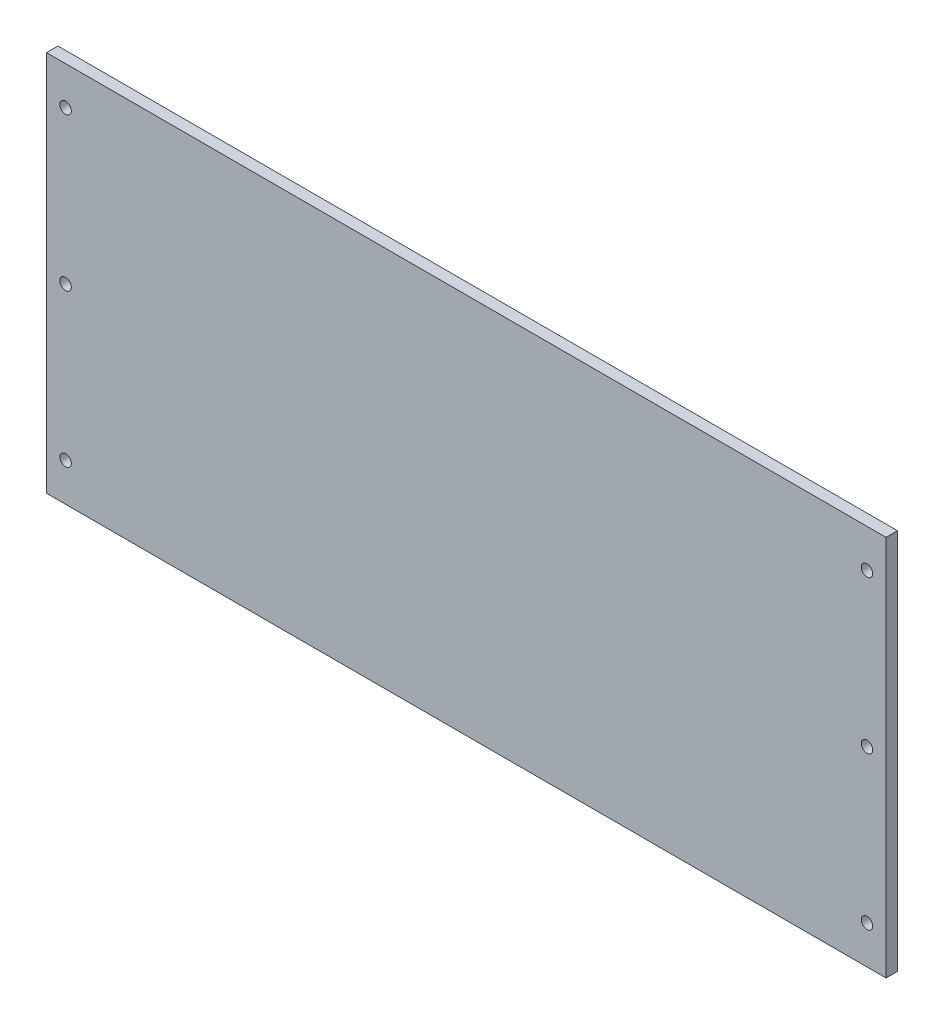
ISO-10303-21;
HEADER;
FILE_DESCRIPTION(('STEP AP214'),'2;1');
FILE_NAME('part.step','',(''),(''),'','','');
FILE_SCHEMA(('AUTOMOTIVE_DESIGN { 1 0 10303 214 1 1 1 1 }'));
ENDSEC;
DATA;
#1=APPLICATION_CONTEXT('core data for automotive mechanical design processes');
#2=APPLICATION_PROTOCOL_DEFINITION('international standard','automotive_design',2000,#1);
#3=PRODUCT_CONTEXT('',#1,'mechanical');
#4=PRODUCT('Part','Part','',(#3));
#5=PRODUCT_RELATED_PRODUCT_CATEGORY('part','',(#4));
#6=PRODUCT_DEFINITION_FORMATION('','',#4);
#7=PRODUCT_DEFINITION_CONTEXT('part definition',#1,'design');
#8=PRODUCT_DEFINITION('design','',#6,#7);
#9=PRODUCT_DEFINITION_SHAPE('','',#8);
#10=(LENGTH_UNIT() NAMED_UNIT(*) SI_UNIT(.MILLI.,.METRE.));
#11=(NAMED_UNIT(*) PLANE_ANGLE_UNIT() SI_UNIT($,.RADIAN.));
#12=(NAMED_UNIT(*) SI_UNIT($,.STERADIAN.) SOLID_ANGLE_UNIT());
#13=UNCERTAINTY_MEASURE_WITH_UNIT(LENGTH_MEASURE(1.E-05),#10,'distance_accuracy_value','');
#14=(GEOMETRIC_REPRESENTATION_CONTEXT(3) GLOBAL_UNCERTAINTY_ASSIGNED_CONTEXT((#13)) GLOBAL_UNIT_ASSIGNED_CONTEXT((#10,
#11,#12)) REPRESENTATION_CONTEXT('',''));
#15=CARTESIAN_POINT('',(0.,0.,0.));
#16=DIRECTION('',(0.,0.,1.));
#17=DIRECTION('',(1.,0.,0.));
#18=AXIS2_PLACEMENT_3D('',#15,#16,#17);
#19=CARTESIAN_POINT('',(0.,0.,3.));
#20=DIRECTION('',(0.,0.,1.));
#21=DIRECTION('',(1.,0.,0.));
#22=AXIS2_PLACEMENT_3D('',#19,#20,#21);
#23=PLANE('',#22);
#24=CARTESIAN_POINT('',(105.,-1.45716771982052E-13,3.));
#25=DIRECTION('',(0.,0.,1.));
#26=DIRECTION('',(-1.,0.,0.));
#27=AXIS2_PLACEMENT_3D('',#24,#25,#26);
#28=CIRCLE('',#27,1.50000000000002);
#29=CARTESIAN_POINT('',(103.5,-1.45716771982052E-13,3.));
#30=VERTEX_POINT('',#29);
#31=EDGE_CURVE('E133',#30,#30,#28,.T.);
#32=ORIENTED_EDGE('',*,*,#31,.F.);
#33=EDGE_LOOP('',(#32));
#34=FACE_BOUND('',#33,.T.);
#35=CARTESIAN_POINT('',(-105.,39.9999999999998,3.));
#36=DIRECTION('',(0.,0.,1.));
#37=DIRECTION('',(1.,0.,0.));
#38=AXIS2_PLACEMENT_3D('',#35,#36,#37);
#39=CIRCLE('',#38,1.5);
#40=CARTESIAN_POINT('',(-103.5,39.9999999999998,3.));
#41=VERTEX_POINT('',#40);
#42=EDGE_CURVE('E121',#41,#41,#39,.T.);
#43=ORIENTED_EDGE('',*,*,#42,.F.);
#44=EDGE_LOOP('',(#43));
#45=FACE_BOUND('',#44,.T.);
#46=CARTESIAN_POINT('',(-105.,-40.0000000000002,3.));
#47=DIRECTION('',(0.,0.,1.));
#48=DIRECTION('',(1.,0.,0.));
#49=AXIS2_PLACEMENT_3D('',#46,#47,#48);
#50=CIRCLE('',#49,1.5);
#51=CARTESIAN_POINT('',(-103.5,-40.0000000000002,3.));
#52=VERTEX_POINT('',#51);
#53=EDGE_CURVE('E100',#52,#52,#50,.T.);
#54=ORIENTED_EDGE('',*,*,#53,.F.);
#55=EDGE_LOOP('',(#54));
#56=FACE_BOUND('',#55,.T.);
#57=DIRECTION('',(0.,-1.,0.));
#58=VECTOR('',#57,1.);
#59=CARTESIAN_POINT('',(-110.,-50.0000000000002,3.));
#60=LINE('',#59,#58);
#61=CARTESIAN_POINT('',(-110.,49.9999999999998,3.));
#62=VERTEX_POINT('',#61);
#63=CARTESIAN_POINT('',(-110.,-50.0000000000002,3.));
#64=VERTEX_POINT('',#63);
#65=EDGE_CURVE('E85',#62,#64,#60,.T.);
#66=ORIENTED_EDGE('',*,*,#65,.T.);
#67=DIRECTION('',(1.,0.,0.));
#68=VECTOR('',#67,1.);
#69=CARTESIAN_POINT('',(110.,-50.0000000000001,3.));
#70=LINE('',#69,#68);
#71=CARTESIAN_POINT('',(110.,-50.0000000000001,3.));
#72=VERTEX_POINT('',#71);
#73=EDGE_CURVE('E80',#64,#72,#70,.T.);
#74=ORIENTED_EDGE('',*,*,#73,.T.);
#75=DIRECTION('',(0.,1.,0.));
#76=VECTOR('',#75,1.);
#77=CARTESIAN_POINT('',(110.,-50.0000000000001,3.));
#78=LINE('',#77,#76);
#79=CARTESIAN_POINT('',(110.,49.9999999999998,3.));
#80=VERTEX_POINT('',#79);
#81=EDGE_CURVE('E83',#72,#80,#78,.T.);
#82=ORIENTED_EDGE('',*,*,#81,.T.);
#83=DIRECTION('',(-1.,0.,0.));
#84=VECTOR('',#83,1.);
#85=CARTESIAN_POINT('',(110.,49.9999999999998,3.));
#86=LINE('',#85,#84);
#87=EDGE_CURVE('E50',#80,#62,#86,.T.);
#88=ORIENTED_EDGE('',*,*,#87,.T.);
#89=EDGE_LOOP('',(#66,#74,#82,#88));
#90=FACE_BOUND('',#89,.T.);
#91=CARTESIAN_POINT('',(-105.,-1.73472347597681E-13,3.));
#92=DIRECTION('',(0.,0.,1.));
#93=DIRECTION('',(1.,0.,0.));
#94=AXIS2_PLACEMENT_3D('',#91,#92,#93);
#95=CIRCLE('',#94,1.5);
#96=CARTESIAN_POINT('',(-103.5,-1.73472347597681E-13,3.));
#97=VERTEX_POINT('',#96);
#98=EDGE_CURVE('E115',#97,#97,#95,.T.);
#99=ORIENTED_EDGE('',*,*,#98,.F.);
#100=EDGE_LOOP('',(#99));
#101=FACE_BOUND('',#100,.T.);
#102=CARTESIAN_POINT('',(105.,39.9999999999999,3.));
#103=DIRECTION('',(0.,0.,1.));
#104=DIRECTION('',(-1.,0.,0.));
#105=AXIS2_PLACEMENT_3D('',#102,#103,#104);
#106=CIRCLE('',#105,1.5);
#107=CARTESIAN_POINT('',(103.5,39.9999999999999,3.));
#108=VERTEX_POINT('',#107);
#109=EDGE_CURVE('E127',#108,#108,#106,.T.);
#110=ORIENTED_EDGE('',*,*,#109,.F.);
#111=EDGE_LOOP('',(#110));
#112=FACE_BOUND('',#111,.T.);
#113=CARTESIAN_POINT('',(105.,-40.0000000000001,3.));
#114=DIRECTION('',(0.,0.,1.));
#115=DIRECTION('',(-1.,0.,0.));
#116=AXIS2_PLACEMENT_3D('',#113,#114,#115);
#117=CIRCLE('',#116,1.5);
#118=CARTESIAN_POINT('',(103.5,-40.0000000000001,3.));
#119=VERTEX_POINT('',#118);
#120=EDGE_CURVE('E139',#119,#119,#117,.T.);
#121=ORIENTED_EDGE('',*,*,#120,.F.);
#122=EDGE_LOOP('',(#121));
#123=FACE_BOUND('',#122,.T.);
#124=ADVANCED_FACE('F33',(#34,#45,#56,#90,#101,#112,#123),#23,.T.);
#125=CARTESIAN_POINT('',(0.,0.,0.));
#126=DIRECTION('',(0.,0.,1.));
#127=DIRECTION('',(1.,0.,0.));
#128=AXIS2_PLACEMENT_3D('',#125,#126,#127);
#129=PLANE('',#128);
#130=DIRECTION('',(0.,-1.,0.));
#131=VECTOR('',#130,1.);
#132=CARTESIAN_POINT('',(-110.,-50.0000000000002,0.));
#133=LINE('',#132,#131);
#134=CARTESIAN_POINT('',(-110.,49.9999999999998,0.));
#135=VERTEX_POINT('',#134);
#136=CARTESIAN_POINT('',(-110.,-50.0000000000002,0.));
#137=VERTEX_POINT('',#136);
#138=EDGE_CURVE('E97',#135,#137,#133,.T.);
#139=ORIENTED_EDGE('',*,*,#138,.F.);
#140=DIRECTION('',(-1.,0.,0.));
#141=VECTOR('',#140,1.);
#142=CARTESIAN_POINT('',(110.,49.9999999999998,0.));
#143=LINE('',#142,#141);
#144=CARTESIAN_POINT('',(110.,49.9999999999998,0.));
#145=VERTEX_POINT('',#144);
#146=EDGE_CURVE('E73',#145,#135,#143,.T.);
#147=ORIENTED_EDGE('',*,*,#146,.F.);
#148=DIRECTION('',(0.,1.,0.));
#149=VECTOR('',#148,1.);
#150=CARTESIAN_POINT('',(110.,-50.0000000000001,0.));
#151=LINE('',#150,#149);
#152=CARTESIAN_POINT('',(110.,-50.0000000000001,0.));
#153=VERTEX_POINT('',#152);
#154=EDGE_CURVE('E67',#153,#145,#151,.T.);
#155=ORIENTED_EDGE('',*,*,#154,.F.);
#156=DIRECTION('',(1.,0.,0.));
#157=VECTOR('',#156,1.);
#158=CARTESIAN_POINT('',(110.,-50.0000000000001,0.));
#159=LINE('',#158,#157);
#160=EDGE_CURVE('E89',#137,#153,#159,.T.);
#161=ORIENTED_EDGE('',*,*,#160,.F.);
#162=EDGE_LOOP('',(#139,#147,#155,#161));
#163=FACE_BOUND('',#162,.T.);
#164=CARTESIAN_POINT('',(-105.,-40.0000000000002,0.));
#165=DIRECTION('',(0.,0.,1.));
#166=DIRECTION('',(1.,0.,0.));
#167=AXIS2_PLACEMENT_3D('',#164,#165,#166);
#168=CIRCLE('',#167,1.5);
#169=CARTESIAN_POINT('',(-103.5,-40.0000000000002,0.));
#170=VERTEX_POINT('',#169);
#171=EDGE_CURVE('E112',#170,#170,#168,.T.);
#172=ORIENTED_EDGE('',*,*,#171,.T.);
#173=EDGE_LOOP('',(#172));
#174=FACE_BOUND('',#173,.T.);
#175=CARTESIAN_POINT('',(-105.,-1.73472347597681E-13,0.));
#176=DIRECTION('',(0.,0.,1.));
#177=DIRECTION('',(1.,0.,0.));
#178=AXIS2_PLACEMENT_3D('',#175,#176,#177);
#179=CIRCLE('',#178,1.5);
#180=CARTESIAN_POINT('',(-103.5,-1.73472347597681E-13,0.));
#181=VERTEX_POINT('',#180);
#182=EDGE_CURVE('E118',#181,#181,#179,.T.);
#183=ORIENTED_EDGE('',*,*,#182,.T.);
#184=EDGE_LOOP('',(#183));
#185=FACE_BOUND('',#184,.T.);
#186=CARTESIAN_POINT('',(-105.,39.9999999999998,0.));
#187=DIRECTION('',(0.,0.,1.));
#188=DIRECTION('',(1.,0.,0.));
#189=AXIS2_PLACEMENT_3D('',#186,#187,#188);
#190=CIRCLE('',#189,1.5);
#191=CARTESIAN_POINT('',(-103.5,39.9999999999998,0.));
#192=VERTEX_POINT('',#191);
#193=EDGE_CURVE('E124',#192,#192,#190,.T.);
#194=ORIENTED_EDGE('',*,*,#193,.T.);
#195=EDGE_LOOP('',(#194));
#196=FACE_BOUND('',#195,.T.);
#197=CARTESIAN_POINT('',(105.,39.9999999999999,0.));
#198=DIRECTION('',(0.,0.,1.));
#199=DIRECTION('',(-1.,0.,0.));
#200=AXIS2_PLACEMENT_3D('',#197,#198,#199);
#201=CIRCLE('',#200,1.5);
#202=CARTESIAN_POINT('',(103.5,39.9999999999999,0.));
#203=VERTEX_POINT('',#202);
#204=EDGE_CURVE('E130',#203,#203,#201,.T.);
#205=ORIENTED_EDGE('',*,*,#204,.T.);
#206=EDGE_LOOP('',(#205));
#207=FACE_BOUND('',#206,.T.);
#208=CARTESIAN_POINT('',(105.,-1.45716771982052E-13,0.));
#209=DIRECTION('',(0.,0.,1.));
#210=DIRECTION('',(-1.,0.,0.));
#211=AXIS2_PLACEMENT_3D('',#208,#209,#210);
#212=CIRCLE('',#211,1.50000000000002);
#213=CARTESIAN_POINT('',(103.5,-1.45716771982052E-13,0.));
#214=VERTEX_POINT('',#213);
#215=EDGE_CURVE('E136',#214,#214,#212,.T.);
#216=ORIENTED_EDGE('',*,*,#215,.T.);
#217=EDGE_LOOP('',(#216));
#218=FACE_BOUND('',#217,.T.);
#219=CARTESIAN_POINT('',(105.,-40.0000000000001,0.));
#220=DIRECTION('',(0.,0.,1.));
#221=DIRECTION('',(-1.,0.,0.));
#222=AXIS2_PLACEMENT_3D('',#219,#220,#221);
#223=CIRCLE('',#222,1.5);
#224=CARTESIAN_POINT('',(103.5,-40.0000000000001,0.));
#225=VERTEX_POINT('',#224);
#226=EDGE_CURVE('E142',#225,#225,#223,.T.);
#227=ORIENTED_EDGE('',*,*,#226,.T.);
#228=EDGE_LOOP('',(#227));
#229=FACE_BOUND('',#228,.T.);
#230=ADVANCED_FACE('F108',(#163,#174,#185,#196,#207,#218,#229),#129,.F.);
#231=CARTESIAN_POINT('',(-110.,-50.0000000000002,3.));
#232=DIRECTION('',(1.,0.,0.));
#233=DIRECTION('',(0.,1.,0.));
#234=AXIS2_PLACEMENT_3D('',#231,#232,#233);
#235=PLANE('',#234);
#236=ORIENTED_EDGE('',*,*,#138,.T.);
#237=DIRECTION('',(0.,0.,-1.));
#238=VECTOR('',#237,1.);
#239=CARTESIAN_POINT('',(-110.,-50.0000000000002,3.));
#240=LINE('',#239,#238);
#241=EDGE_CURVE('E11',#64,#137,#240,.T.);
#242=ORIENTED_EDGE('',*,*,#241,.F.);
#243=ORIENTED_EDGE('',*,*,#65,.F.);
#244=DIRECTION('',(0.,0.,-1.));
#245=VECTOR('',#244,1.);
#246=CARTESIAN_POINT('',(-110.,49.9999999999998,3.));
#247=LINE('',#246,#245);
#248=EDGE_CURVE('E93',#62,#135,#247,.T.);
#249=ORIENTED_EDGE('',*,*,#248,.T.);
#250=EDGE_LOOP('',(#236,#242,#243,#249));
#251=FACE_BOUND('',#250,.T.);
#252=ADVANCED_FACE('F35',(#251),#235,.F.);
#253=CARTESIAN_POINT('',(110.,-50.0000000000001,3.));
#254=DIRECTION('',(0.,1.,0.));
#255=DIRECTION('',(-1.,0.,0.));
#256=AXIS2_PLACEMENT_3D('',#253,#254,#255);
#257=PLANE('',#256);
#258=ORIENTED_EDGE('',*,*,#160,.T.);
#259=DIRECTION('',(0.,0.,-1.));
#260=VECTOR('',#259,1.);
#261=CARTESIAN_POINT('',(110.,-50.0000000000001,3.));
#262=LINE('',#261,#260);
#263=EDGE_CURVE('E42',#72,#153,#262,.T.);
#264=ORIENTED_EDGE('',*,*,#263,.F.);
#265=ORIENTED_EDGE('',*,*,#73,.F.);
#266=ORIENTED_EDGE('',*,*,#241,.T.);
#267=EDGE_LOOP('',(#258,#264,#265,#266));
#268=FACE_BOUND('',#267,.T.);
#269=ADVANCED_FACE('F88',(#268),#257,.F.);
#270=CARTESIAN_POINT('',(110.,-50.0000000000001,3.));
#271=DIRECTION('',(-1.,0.,0.));
#272=DIRECTION('',(0.,-1.,0.));
#273=AXIS2_PLACEMENT_3D('',#270,#271,#272);
#274=PLANE('',#273);
#275=ORIENTED_EDGE('',*,*,#154,.T.);
#276=DIRECTION('',(0.,0.,-1.));
#277=VECTOR('',#276,1.);
#278=CARTESIAN_POINT('',(110.,49.9999999999998,3.));
#279=LINE('',#278,#277);
#280=EDGE_CURVE('E90',#80,#145,#279,.T.);
#281=ORIENTED_EDGE('',*,*,#280,.F.);
#282=ORIENTED_EDGE('',*,*,#81,.F.);
#283=ORIENTED_EDGE('',*,*,#263,.T.);
#284=EDGE_LOOP('',(#275,#281,#282,#283));
#285=FACE_BOUND('',#284,.T.);
#286=ADVANCED_FACE('F91',(#285),#274,.F.);
#287=CARTESIAN_POINT('',(110.,49.9999999999998,3.));
#288=DIRECTION('',(0.,-1.,0.));
#289=DIRECTION('',(0.,0.,-1.));
#290=AXIS2_PLACEMENT_3D('',#287,#288,#289);
#291=PLANE('',#290);
#292=ORIENTED_EDGE('',*,*,#146,.T.);
#293=ORIENTED_EDGE('',*,*,#248,.F.);
#294=ORIENTED_EDGE('',*,*,#87,.F.);
#295=ORIENTED_EDGE('',*,*,#280,.T.);
#296=EDGE_LOOP('',(#292,#293,#294,#295));
#297=FACE_BOUND('',#296,.T.);
#298=ADVANCED_FACE('F105',(#297),#291,.F.);
#299=CARTESIAN_POINT('',(-105.,-40.0000000000002,3.));
#300=DIRECTION('',(0.,0.,-1.));
#301=DIRECTION('',(-1.,0.,0.));
#302=AXIS2_PLACEMENT_3D('',#299,#300,#301);
#303=CYLINDRICAL_SURFACE('',#302,1.5);
#304=ORIENTED_EDGE('',*,*,#53,.T.);
#305=EDGE_LOOP('',(#304));
#306=FACE_BOUND('',#305,.T.);
#307=ORIENTED_EDGE('',*,*,#171,.F.);
#308=EDGE_LOOP('',(#307));
#309=FACE_BOUND('',#308,.T.);
#310=ADVANCED_FACE('F161',(#306,#309),#303,.F.);
#311=CARTESIAN_POINT('',(-105.,-1.73472347597681E-13,3.));
#312=DIRECTION('',(0.,0.,-1.));
#313=DIRECTION('',(-1.,0.,0.));
#314=AXIS2_PLACEMENT_3D('',#311,#312,#313);
#315=CYLINDRICAL_SURFACE('',#314,1.5);
#316=ORIENTED_EDGE('',*,*,#98,.T.);
#317=EDGE_LOOP('',(#316));
#318=FACE_BOUND('',#317,.T.);
#319=ORIENTED_EDGE('',*,*,#182,.F.);
#320=EDGE_LOOP('',(#319));
#321=FACE_BOUND('',#320,.T.);
#322=ADVANCED_FACE('F207',(#318,#321),#315,.F.);
#323=CARTESIAN_POINT('',(-105.,39.9999999999998,3.));
#324=DIRECTION('',(0.,0.,-1.));
#325=DIRECTION('',(-1.,0.,0.));
#326=AXIS2_PLACEMENT_3D('',#323,#324,#325);
#327=CYLINDRICAL_SURFACE('',#326,1.5);
#328=ORIENTED_EDGE('',*,*,#42,.T.);
#329=EDGE_LOOP('',(#328));
#330=FACE_BOUND('',#329,.T.);
#331=ORIENTED_EDGE('',*,*,#193,.F.);
#332=EDGE_LOOP('',(#331));
#333=FACE_BOUND('',#332,.T.);
#334=ADVANCED_FACE('F215',(#330,#333),#327,.F.);
#335=CARTESIAN_POINT('',(105.,39.9999999999999,3.));
#336=DIRECTION('',(0.,0.,-1.));
#337=DIRECTION('',(-1.,0.,0.));
#338=AXIS2_PLACEMENT_3D('',#335,#336,#337);
#339=CYLINDRICAL_SURFACE('',#338,1.5);
#340=ORIENTED_EDGE('',*,*,#109,.T.);
#341=EDGE_LOOP('',(#340));
#342=FACE_BOUND('',#341,.T.);
#343=ORIENTED_EDGE('',*,*,#204,.F.);
#344=EDGE_LOOP('',(#343));
#345=FACE_BOUND('',#344,.T.);
#346=ADVANCED_FACE('F223',(#342,#345),#339,.F.);
#347=CARTESIAN_POINT('',(105.,-1.45716771982052E-13,3.));
#348=DIRECTION('',(0.,0.,-1.));
#349=DIRECTION('',(-1.,0.,0.));
#350=AXIS2_PLACEMENT_3D('',#347,#348,#349);
#351=CYLINDRICAL_SURFACE('',#350,1.50000000000002);
#352=ORIENTED_EDGE('',*,*,#31,.T.);
#353=EDGE_LOOP('',(#352));
#354=FACE_BOUND('',#353,.T.);
#355=ORIENTED_EDGE('',*,*,#215,.F.);
#356=EDGE_LOOP('',(#355));
#357=FACE_BOUND('',#356,.T.);
#358=ADVANCED_FACE('F232',(#354,#357),#351,.F.);
#359=CARTESIAN_POINT('',(105.,-40.0000000000001,3.));
#360=DIRECTION('',(0.,0.,-1.));
#361=DIRECTION('',(-1.,0.,0.));
#362=AXIS2_PLACEMENT_3D('',#359,#360,#361);
#363=CYLINDRICAL_SURFACE('',#362,1.5);
#364=ORIENTED_EDGE('',*,*,#120,.T.);
#365=EDGE_LOOP('',(#364));
#366=FACE_BOUND('',#365,.T.);
#367=ORIENTED_EDGE('',*,*,#226,.F.);
#368=EDGE_LOOP('',(#367));
#369=FACE_BOUND('',#368,.T.);
#370=ADVANCED_FACE('F148',(#366,#369),#363,.F.);
#371=CLOSED_SHELL('',(#124,#230,#252,#269,#286,#298,#310,#322,#334,#346,#358,#370));
#372=MANIFOLD_SOLID_BREP('B2',#371);
#373=ADVANCED_BREP_SHAPE_REPRESENTATION('',(#18,#372),#14);
#374=SHAPE_DEFINITION_REPRESENTATION(#9,#373);
ENDSEC;
END-ISO-10303-21;
